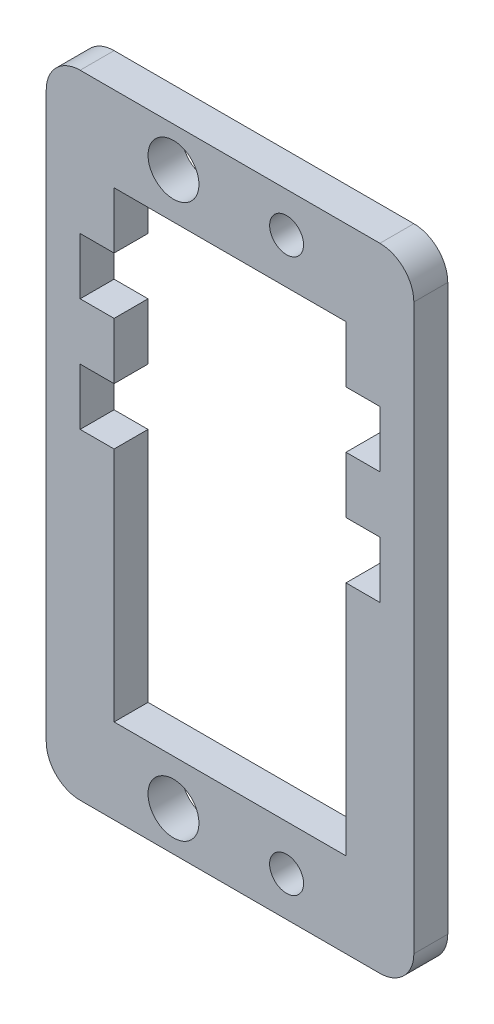
ISO-10303-21;
HEADER;
FILE_DESCRIPTION(('STEP AP214'),'2;1');
FILE_NAME('part.step','',(''),(''),'','','');
FILE_SCHEMA(('AUTOMOTIVE_DESIGN { 1 0 10303 214 1 1 1 1 }'));
ENDSEC;
DATA;
#1=APPLICATION_CONTEXT('core data for automotive mechanical design processes');
#2=APPLICATION_PROTOCOL_DEFINITION('international standard','automotive_design',2000,#1);
#3=PRODUCT_CONTEXT('',#1,'mechanical');
#4=PRODUCT('Part','Part','',(#3));
#5=PRODUCT_RELATED_PRODUCT_CATEGORY('part','',(#4));
#6=PRODUCT_DEFINITION_FORMATION('','',#4);
#7=PRODUCT_DEFINITION_CONTEXT('part definition',#1,'design');
#8=PRODUCT_DEFINITION('design','',#6,#7);
#9=PRODUCT_DEFINITION_SHAPE('','',#8);
#10=(LENGTH_UNIT() NAMED_UNIT(*) SI_UNIT(.MILLI.,.METRE.));
#11=(NAMED_UNIT(*) PLANE_ANGLE_UNIT() SI_UNIT($,.RADIAN.));
#12=(NAMED_UNIT(*) SI_UNIT($,.STERADIAN.) SOLID_ANGLE_UNIT());
#13=UNCERTAINTY_MEASURE_WITH_UNIT(LENGTH_MEASURE(1.E-05),#10,'distance_accuracy_value','');
#14=(GEOMETRIC_REPRESENTATION_CONTEXT(3) GLOBAL_UNCERTAINTY_ASSIGNED_CONTEXT((#13)) GLOBAL_UNIT_ASSIGNED_CONTEXT((#10,
#11,#12)) REPRESENTATION_CONTEXT('',''));
#15=CARTESIAN_POINT('',(0.,0.,0.));
#16=DIRECTION('',(0.,0.,1.));
#17=DIRECTION('',(1.,0.,0.));
#18=AXIS2_PLACEMENT_3D('',#15,#16,#17);
#19=CARTESIAN_POINT('',(-13.25,24.95,3.));
#20=DIRECTION('',(0.,0.,-1.));
#21=DIRECTION('',(-1.,0.,0.));
#22=AXIS2_PLACEMENT_3D('',#19,#20,#21);
#23=PLANE('',#22);
#24=CARTESIAN_POINT('',(-13.25,24.95,3.));
#25=DIRECTION('',(0.,0.,1.));
#26=DIRECTION('',(-1.,0.,0.));
#27=AXIS2_PLACEMENT_3D('',#24,#25,#26);
#28=CIRCLE('',#27,3.);
#29=CARTESIAN_POINT('',(-13.25,27.95,3.));
#30=VERTEX_POINT('',#29);
#31=CARTESIAN_POINT('',(-16.25,24.95,3.));
#32=VERTEX_POINT('',#31);
#33=EDGE_CURVE('E370',#30,#32,#28,.T.);
#34=ORIENTED_EDGE('',*,*,#33,.T.);
#35=DIRECTION('',(0.,-1.,0.));
#36=VECTOR('',#35,1.);
#37=CARTESIAN_POINT('',(-16.25,-24.95,3.));
#38=LINE('',#37,#36);
#39=CARTESIAN_POINT('',(-16.25,-24.95,3.));
#40=VERTEX_POINT('',#39);
#41=EDGE_CURVE('E373',#32,#40,#38,.T.);
#42=ORIENTED_EDGE('',*,*,#41,.T.);
#43=CARTESIAN_POINT('',(-13.25,-24.95,3.));
#44=DIRECTION('',(0.,0.,1.));
#45=DIRECTION('',(-1.,0.,0.));
#46=AXIS2_PLACEMENT_3D('',#43,#44,#45);
#47=CIRCLE('',#46,3.);
#48=CARTESIAN_POINT('',(-13.25,-27.95,3.));
#49=VERTEX_POINT('',#48);
#50=EDGE_CURVE('E376',#40,#49,#47,.T.);
#51=ORIENTED_EDGE('',*,*,#50,.T.);
#52=DIRECTION('',(1.,0.,0.));
#53=VECTOR('',#52,1.);
#54=CARTESIAN_POINT('',(13.25,-27.95,3.));
#55=LINE('',#54,#53);
#56=CARTESIAN_POINT('',(13.25,-27.95,3.));
#57=VERTEX_POINT('',#56);
#58=EDGE_CURVE('E378',#49,#57,#55,.T.);
#59=ORIENTED_EDGE('',*,*,#58,.T.);
#60=CARTESIAN_POINT('',(13.25,-24.95,3.));
#61=DIRECTION('',(0.,0.,1.));
#62=DIRECTION('',(-1.,0.,0.));
#63=AXIS2_PLACEMENT_3D('',#60,#61,#62);
#64=CIRCLE('',#63,3.);
#65=CARTESIAN_POINT('',(16.25,-24.95,3.));
#66=VERTEX_POINT('',#65);
#67=EDGE_CURVE('E380',#57,#66,#64,.T.);
#68=ORIENTED_EDGE('',*,*,#67,.T.);
#69=DIRECTION('',(0.,1.,0.));
#70=VECTOR('',#69,1.);
#71=CARTESIAN_POINT('',(16.25,24.95,3.));
#72=LINE('',#71,#70);
#73=CARTESIAN_POINT('',(16.25,24.95,3.));
#74=VERTEX_POINT('',#73);
#75=EDGE_CURVE('E382',#66,#74,#72,.T.);
#76=ORIENTED_EDGE('',*,*,#75,.T.);
#77=CARTESIAN_POINT('',(13.25,24.95,3.));
#78=DIRECTION('',(0.,0.,1.));
#79=DIRECTION('',(-1.,0.,0.));
#80=AXIS2_PLACEMENT_3D('',#77,#78,#79);
#81=CIRCLE('',#80,3.);
#82=CARTESIAN_POINT('',(13.25,27.95,3.));
#83=VERTEX_POINT('',#82);
#84=EDGE_CURVE('E384',#74,#83,#81,.T.);
#85=ORIENTED_EDGE('',*,*,#84,.T.);
#86=DIRECTION('',(-1.,0.,0.));
#87=VECTOR('',#86,1.);
#88=CARTESIAN_POINT('',(-13.25,27.95,3.));
#89=LINE('',#88,#87);
#90=EDGE_CURVE('E386',#83,#30,#89,.T.);
#91=ORIENTED_EDGE('',*,*,#90,.T.);
#92=EDGE_LOOP('',(#34,#42,#51,#59,#68,#76,#85,#91));
#93=FACE_BOUND('',#92,.T.);
#94=DIRECTION('',(0.,1.,0.));
#95=VECTOR('',#94,1.);
#96=CARTESIAN_POINT('',(10.25,0.45,3.));
#97=LINE('',#96,#95);
#98=CARTESIAN_POINT('',(10.25,-20.45,3.));
#99=VERTEX_POINT('',#98);
#100=CARTESIAN_POINT('',(10.25,0.45,3.));
#101=VERTEX_POINT('',#100);
#102=EDGE_CURVE('E218',#99,#101,#97,.T.);
#103=ORIENTED_EDGE('',*,*,#102,.F.);
#104=DIRECTION('',(1.,0.,0.));
#105=VECTOR('',#104,1.);
#106=CARTESIAN_POINT('',(-10.25,-20.45,3.));
#107=LINE('',#106,#105);
#108=CARTESIAN_POINT('',(-10.25,-20.45,3.));
#109=VERTEX_POINT('',#108);
#110=EDGE_CURVE('E277',#109,#99,#107,.T.);
#111=ORIENTED_EDGE('',*,*,#110,.F.);
#112=DIRECTION('',(0.,-1.,0.));
#113=VECTOR('',#112,1.);
#114=CARTESIAN_POINT('',(-10.25,0.449999999999998,3.));
#115=LINE('',#114,#113);
#116=CARTESIAN_POINT('',(-10.25,0.449999999999998,3.));
#117=VERTEX_POINT('',#116);
#118=EDGE_CURVE('E275',#117,#109,#115,.T.);
#119=ORIENTED_EDGE('',*,*,#118,.F.);
#120=DIRECTION('',(1.,0.,0.));
#121=VECTOR('',#120,1.);
#122=CARTESIAN_POINT('',(-13.25,0.449999999999998,3.));
#123=LINE('',#122,#121);
#124=CARTESIAN_POINT('',(-13.25,0.449999999999998,3.));
#125=VERTEX_POINT('',#124);
#126=EDGE_CURVE('E273',#125,#117,#123,.T.);
#127=ORIENTED_EDGE('',*,*,#126,.F.);
#128=DIRECTION('',(0.,-1.,0.));
#129=VECTOR('',#128,1.);
#130=CARTESIAN_POINT('',(-13.25,5.45,3.));
#131=LINE('',#130,#129);
#132=CARTESIAN_POINT('',(-13.25,5.45,3.));
#133=VERTEX_POINT('',#132);
#134=EDGE_CURVE('E271',#133,#125,#131,.T.);
#135=ORIENTED_EDGE('',*,*,#134,.F.);
#136=DIRECTION('',(-1.,0.,0.));
#137=VECTOR('',#136,1.);
#138=CARTESIAN_POINT('',(-10.25,5.45,3.));
#139=LINE('',#138,#137);
#140=CARTESIAN_POINT('',(-10.25,5.45,3.));
#141=VERTEX_POINT('',#140);
#142=EDGE_CURVE('E269',#141,#133,#139,.T.);
#143=ORIENTED_EDGE('',*,*,#142,.F.);
#144=DIRECTION('',(0.,-1.,0.));
#145=VECTOR('',#144,1.);
#146=CARTESIAN_POINT('',(-10.25,10.45,3.));
#147=LINE('',#146,#145);
#148=CARTESIAN_POINT('',(-10.25,10.45,3.));
#149=VERTEX_POINT('',#148);
#150=EDGE_CURVE('E267',#149,#141,#147,.T.);
#151=ORIENTED_EDGE('',*,*,#150,.F.);
#152=DIRECTION('',(1.,0.,0.));
#153=VECTOR('',#152,1.);
#154=CARTESIAN_POINT('',(-13.25,10.45,3.));
#155=LINE('',#154,#153);
#156=CARTESIAN_POINT('',(-13.25,10.45,3.));
#157=VERTEX_POINT('',#156);
#158=EDGE_CURVE('E265',#157,#149,#155,.T.);
#159=ORIENTED_EDGE('',*,*,#158,.F.);
#160=DIRECTION('',(0.,-1.,0.));
#161=VECTOR('',#160,1.);
#162=CARTESIAN_POINT('',(-13.25,15.45,3.));
#163=LINE('',#162,#161);
#164=CARTESIAN_POINT('',(-13.25,15.45,3.));
#165=VERTEX_POINT('',#164);
#166=EDGE_CURVE('E263',#165,#157,#163,.T.);
#167=ORIENTED_EDGE('',*,*,#166,.F.);
#168=DIRECTION('',(-1.,0.,0.));
#169=VECTOR('',#168,1.);
#170=CARTESIAN_POINT('',(-10.25,15.45,3.));
#171=LINE('',#170,#169);
#172=CARTESIAN_POINT('',(-10.25,15.45,3.));
#173=VERTEX_POINT('',#172);
#174=EDGE_CURVE('E261',#173,#165,#171,.T.);
#175=ORIENTED_EDGE('',*,*,#174,.F.);
#176=DIRECTION('',(0.,-1.,0.));
#177=VECTOR('',#176,1.);
#178=CARTESIAN_POINT('',(-10.25,20.45,3.));
#179=LINE('',#178,#177);
#180=CARTESIAN_POINT('',(-10.25,20.45,3.));
#181=VERTEX_POINT('',#180);
#182=EDGE_CURVE('E259',#181,#173,#179,.T.);
#183=ORIENTED_EDGE('',*,*,#182,.F.);
#184=DIRECTION('',(-1.,0.,0.));
#185=VECTOR('',#184,1.);
#186=CARTESIAN_POINT('',(-10.25,20.45,3.));
#187=LINE('',#186,#185);
#188=CARTESIAN_POINT('',(10.25,20.45,3.));
#189=VERTEX_POINT('',#188);
#190=EDGE_CURVE('E257',#189,#181,#187,.T.);
#191=ORIENTED_EDGE('',*,*,#190,.F.);
#192=DIRECTION('',(0.,1.,0.));
#193=VECTOR('',#192,1.);
#194=CARTESIAN_POINT('',(10.25,20.45,3.));
#195=LINE('',#194,#193);
#196=CARTESIAN_POINT('',(10.25,15.45,3.));
#197=VERTEX_POINT('',#196);
#198=EDGE_CURVE('E255',#197,#189,#195,.T.);
#199=ORIENTED_EDGE('',*,*,#198,.F.);
#200=DIRECTION('',(-1.,0.,0.));
#201=VECTOR('',#200,1.);
#202=CARTESIAN_POINT('',(10.25,15.45,3.));
#203=LINE('',#202,#201);
#204=CARTESIAN_POINT('',(13.25,15.45,3.));
#205=VERTEX_POINT('',#204);
#206=EDGE_CURVE('E253',#205,#197,#203,.T.);
#207=ORIENTED_EDGE('',*,*,#206,.F.);
#208=DIRECTION('',(0.,1.,0.));
#209=VECTOR('',#208,1.);
#210=CARTESIAN_POINT('',(13.25,15.45,3.));
#211=LINE('',#210,#209);
#212=CARTESIAN_POINT('',(13.25,10.45,3.));
#213=VERTEX_POINT('',#212);
#214=EDGE_CURVE('E251',#213,#205,#211,.T.);
#215=ORIENTED_EDGE('',*,*,#214,.F.);
#216=DIRECTION('',(1.,0.,0.));
#217=VECTOR('',#216,1.);
#218=CARTESIAN_POINT('',(13.25,10.45,3.));
#219=LINE('',#218,#217);
#220=CARTESIAN_POINT('',(10.25,10.45,3.));
#221=VERTEX_POINT('',#220);
#222=EDGE_CURVE('E249',#221,#213,#219,.T.);
#223=ORIENTED_EDGE('',*,*,#222,.F.);
#224=DIRECTION('',(0.,1.,0.));
#225=VECTOR('',#224,1.);
#226=CARTESIAN_POINT('',(10.25,10.45,3.));
#227=LINE('',#226,#225);
#228=CARTESIAN_POINT('',(10.25,5.45,3.));
#229=VERTEX_POINT('',#228);
#230=EDGE_CURVE('E247',#229,#221,#227,.T.);
#231=ORIENTED_EDGE('',*,*,#230,.F.);
#232=DIRECTION('',(-1.,0.,0.));
#233=VECTOR('',#232,1.);
#234=CARTESIAN_POINT('',(10.25,5.45,3.));
#235=LINE('',#234,#233);
#236=CARTESIAN_POINT('',(13.25,5.45,3.));
#237=VERTEX_POINT('',#236);
#238=EDGE_CURVE('E242',#237,#229,#235,.T.);
#239=ORIENTED_EDGE('',*,*,#238,.F.);
#240=DIRECTION('',(0.,1.,0.));
#241=VECTOR('',#240,1.);
#242=CARTESIAN_POINT('',(13.25,5.45,3.));
#243=LINE('',#242,#241);
#244=CARTESIAN_POINT('',(13.25,0.450000000000001,3.));
#245=VERTEX_POINT('',#244);
#246=EDGE_CURVE('E240',#245,#237,#243,.T.);
#247=ORIENTED_EDGE('',*,*,#246,.F.);
#248=DIRECTION('',(1.,0.,0.));
#249=VECTOR('',#248,1.);
#250=CARTESIAN_POINT('',(13.25,0.450000000000001,3.));
#251=LINE('',#250,#249);
#252=EDGE_CURVE('E226',#101,#245,#251,.T.);
#253=ORIENTED_EDGE('',*,*,#252,.F.);
#254=EDGE_LOOP('',(#103,#111,#119,#127,#135,#143,#151,#159,#167,#175,#183,#191,#199,#207,#215,
#223,#231,#239,#247,#253));
#255=FACE_BOUND('',#254,.T.);
#256=CARTESIAN_POINT('',(-5.,24.45,3.));
#257=DIRECTION('',(0.,0.,1.));
#258=DIRECTION('',(1.,0.,0.));
#259=AXIS2_PLACEMENT_3D('',#256,#257,#258);
#260=CIRCLE('',#259,2.25);
#261=CARTESIAN_POINT('',(-2.75,24.45,3.));
#262=VERTEX_POINT('',#261);
#263=EDGE_CURVE('E280',#262,#262,#260,.T.);
#264=ORIENTED_EDGE('',*,*,#263,.F.);
#265=EDGE_LOOP('',(#264));
#266=FACE_BOUND('',#265,.T.);
#267=CARTESIAN_POINT('',(5.,24.45,3.));
#268=DIRECTION('',(0.,0.,1.));
#269=DIRECTION('',(1.,0.,0.));
#270=AXIS2_PLACEMENT_3D('',#267,#268,#269);
#271=CIRCLE('',#270,1.5);
#272=CARTESIAN_POINT('',(6.5,24.45,3.));
#273=VERTEX_POINT('',#272);
#274=EDGE_CURVE('E596',#273,#273,#271,.T.);
#275=ORIENTED_EDGE('',*,*,#274,.F.);
#276=EDGE_LOOP('',(#275));
#277=FACE_BOUND('',#276,.T.);
#278=CARTESIAN_POINT('',(5.00000000000001,-24.45,3.));
#279=DIRECTION('',(0.,0.,1.));
#280=DIRECTION('',(-1.,0.,0.));
#281=AXIS2_PLACEMENT_3D('',#278,#279,#280);
#282=CIRCLE('',#281,1.5);
#283=CARTESIAN_POINT('',(3.50000000000001,-24.45,3.));
#284=VERTEX_POINT('',#283);
#285=EDGE_CURVE('E590',#284,#284,#282,.T.);
#286=ORIENTED_EDGE('',*,*,#285,.F.);
#287=EDGE_LOOP('',(#286));
#288=FACE_BOUND('',#287,.T.);
#289=CARTESIAN_POINT('',(-4.99999999999999,-24.45,3.));
#290=DIRECTION('',(0.,0.,1.));
#291=DIRECTION('',(-1.,0.,0.));
#292=AXIS2_PLACEMENT_3D('',#289,#290,#291);
#293=CIRCLE('',#292,2.25);
#294=CARTESIAN_POINT('',(-7.24999999999999,-24.45,3.));
#295=VERTEX_POINT('',#294);
#296=EDGE_CURVE('E581',#295,#295,#293,.T.);
#297=ORIENTED_EDGE('',*,*,#296,.F.);
#298=EDGE_LOOP('',(#297));
#299=FACE_BOUND('',#298,.T.);
#300=ADVANCED_FACE('F33',(#93,#255,#266,#277,#288,#299),#23,.F.);
#301=CARTESIAN_POINT('',(-13.25,24.95,0.));
#302=DIRECTION('',(0.,0.,-1.));
#303=DIRECTION('',(-1.,0.,0.));
#304=AXIS2_PLACEMENT_3D('',#301,#302,#303);
#305=PLANE('',#304);
#306=CARTESIAN_POINT('',(5.00000000000001,-24.45,0.));
#307=DIRECTION('',(0.,0.,1.));
#308=DIRECTION('',(-1.,0.,0.));
#309=AXIS2_PLACEMENT_3D('',#306,#307,#308);
#310=CIRCLE('',#309,1.5);
#311=CARTESIAN_POINT('',(3.50000000000001,-24.45,0.));
#312=VERTEX_POINT('',#311);
#313=EDGE_CURVE('E587',#312,#312,#310,.T.);
#314=ORIENTED_EDGE('',*,*,#313,.T.);
#315=EDGE_LOOP('',(#314));
#316=FACE_BOUND('',#315,.T.);
#317=CARTESIAN_POINT('',(-5.,24.45,0.));
#318=DIRECTION('',(0.,0.,1.));
#319=DIRECTION('',(1.,0.,0.));
#320=AXIS2_PLACEMENT_3D('',#317,#318,#319);
#321=CIRCLE('',#320,2.25);
#322=CARTESIAN_POINT('',(-2.75,24.45,0.));
#323=VERTEX_POINT('',#322);
#324=EDGE_CURVE('E599',#323,#323,#321,.T.);
#325=ORIENTED_EDGE('',*,*,#324,.T.);
#326=EDGE_LOOP('',(#325));
#327=FACE_BOUND('',#326,.T.);
#328=CARTESIAN_POINT('',(-13.25,24.95,0.));
#329=DIRECTION('',(0.,0.,1.));
#330=DIRECTION('',(-1.,0.,0.));
#331=AXIS2_PLACEMENT_3D('',#328,#329,#330);
#332=CIRCLE('',#331,3.);
#333=CARTESIAN_POINT('',(-13.25,27.95,0.));
#334=VERTEX_POINT('',#333);
#335=CARTESIAN_POINT('',(-16.25,24.95,0.));
#336=VERTEX_POINT('',#335);
#337=EDGE_CURVE('E234',#334,#336,#332,.T.);
#338=ORIENTED_EDGE('',*,*,#337,.F.);
#339=DIRECTION('',(-1.,0.,0.));
#340=VECTOR('',#339,1.);
#341=CARTESIAN_POINT('',(-13.25,27.95,0.));
#342=LINE('',#341,#340);
#343=CARTESIAN_POINT('',(13.25,27.95,0.));
#344=VERTEX_POINT('',#343);
#345=EDGE_CURVE('E374',#344,#334,#342,.T.);
#346=ORIENTED_EDGE('',*,*,#345,.F.);
#347=CARTESIAN_POINT('',(13.25,24.95,0.));
#348=DIRECTION('',(0.,0.,1.));
#349=DIRECTION('',(-1.,0.,0.));
#350=AXIS2_PLACEMENT_3D('',#347,#348,#349);
#351=CIRCLE('',#350,3.);
#352=CARTESIAN_POINT('',(16.25,24.95,0.));
#353=VERTEX_POINT('',#352);
#354=EDGE_CURVE('E401',#353,#344,#351,.T.);
#355=ORIENTED_EDGE('',*,*,#354,.F.);
#356=DIRECTION('',(0.,1.,0.));
#357=VECTOR('',#356,1.);
#358=CARTESIAN_POINT('',(16.25,24.95,0.));
#359=LINE('',#358,#357);
#360=CARTESIAN_POINT('',(16.25,-24.95,0.));
#361=VERTEX_POINT('',#360);
#362=EDGE_CURVE('E399',#361,#353,#359,.T.);
#363=ORIENTED_EDGE('',*,*,#362,.F.);
#364=CARTESIAN_POINT('',(13.25,-24.95,0.));
#365=DIRECTION('',(0.,0.,1.));
#366=DIRECTION('',(-1.,0.,0.));
#367=AXIS2_PLACEMENT_3D('',#364,#365,#366);
#368=CIRCLE('',#367,3.);
#369=CARTESIAN_POINT('',(13.25,-27.95,0.));
#370=VERTEX_POINT('',#369);
#371=EDGE_CURVE('E397',#370,#361,#368,.T.);
#372=ORIENTED_EDGE('',*,*,#371,.F.);
#373=DIRECTION('',(1.,0.,0.));
#374=VECTOR('',#373,1.);
#375=CARTESIAN_POINT('',(13.25,-27.95,0.));
#376=LINE('',#375,#374);
#377=CARTESIAN_POINT('',(-13.25,-27.95,0.));
#378=VERTEX_POINT('',#377);
#379=EDGE_CURVE('E395',#378,#370,#376,.T.);
#380=ORIENTED_EDGE('',*,*,#379,.F.);
#381=CARTESIAN_POINT('',(-13.25,-24.95,0.));
#382=DIRECTION('',(0.,0.,1.));
#383=DIRECTION('',(-1.,0.,0.));
#384=AXIS2_PLACEMENT_3D('',#381,#382,#383);
#385=CIRCLE('',#384,3.);
#386=CARTESIAN_POINT('',(-16.25,-24.95,0.));
#387=VERTEX_POINT('',#386);
#388=EDGE_CURVE('E393',#387,#378,#385,.T.);
#389=ORIENTED_EDGE('',*,*,#388,.F.);
#390=DIRECTION('',(0.,-1.,0.));
#391=VECTOR('',#390,1.);
#392=CARTESIAN_POINT('',(-16.25,-24.95,0.));
#393=LINE('',#392,#391);
#394=EDGE_CURVE('E391',#336,#387,#393,.T.);
#395=ORIENTED_EDGE('',*,*,#394,.F.);
#396=EDGE_LOOP('',(#338,#346,#355,#363,#372,#380,#389,#395));
#397=FACE_BOUND('',#396,.T.);
#398=DIRECTION('',(1.,0.,0.));
#399=VECTOR('',#398,1.);
#400=CARTESIAN_POINT('',(-10.25,-20.45,0.));
#401=LINE('',#400,#399);
#402=CARTESIAN_POINT('',(-10.25,-20.45,0.));
#403=VERTEX_POINT('',#402);
#404=CARTESIAN_POINT('',(10.25,-20.45,0.));
#405=VERTEX_POINT('',#404);
#406=EDGE_CURVE('E227',#403,#405,#401,.T.);
#407=ORIENTED_EDGE('',*,*,#406,.T.);
#408=DIRECTION('',(0.,1.,0.));
#409=VECTOR('',#408,1.);
#410=CARTESIAN_POINT('',(10.25,0.45,0.));
#411=LINE('',#410,#409);
#412=CARTESIAN_POINT('',(10.25,0.45,0.));
#413=VERTEX_POINT('',#412);
#414=EDGE_CURVE('E56',#405,#413,#411,.T.);
#415=ORIENTED_EDGE('',*,*,#414,.T.);
#416=DIRECTION('',(1.,0.,0.));
#417=VECTOR('',#416,1.);
#418=CARTESIAN_POINT('',(13.25,0.450000000000001,0.));
#419=LINE('',#418,#417);
#420=CARTESIAN_POINT('',(13.25,0.450000000000001,0.));
#421=VERTEX_POINT('',#420);
#422=EDGE_CURVE('E233',#413,#421,#419,.T.);
#423=ORIENTED_EDGE('',*,*,#422,.T.);
#424=DIRECTION('',(0.,1.,0.));
#425=VECTOR('',#424,1.);
#426=CARTESIAN_POINT('',(13.25,5.45,0.));
#427=LINE('',#426,#425);
#428=CARTESIAN_POINT('',(13.25,5.45,0.));
#429=VERTEX_POINT('',#428);
#430=EDGE_CURVE('E282',#421,#429,#427,.T.);
#431=ORIENTED_EDGE('',*,*,#430,.T.);
#432=DIRECTION('',(-1.,0.,0.));
#433=VECTOR('',#432,1.);
#434=CARTESIAN_POINT('',(10.25,5.45,0.));
#435=LINE('',#434,#433);
#436=CARTESIAN_POINT('',(10.25,5.45,0.));
#437=VERTEX_POINT('',#436);
#438=EDGE_CURVE('E285',#429,#437,#435,.T.);
#439=ORIENTED_EDGE('',*,*,#438,.T.);
#440=DIRECTION('',(0.,1.,0.));
#441=VECTOR('',#440,1.);
#442=CARTESIAN_POINT('',(10.25,10.45,0.));
#443=LINE('',#442,#441);
#444=CARTESIAN_POINT('',(10.25,10.45,0.));
#445=VERTEX_POINT('',#444);
#446=EDGE_CURVE('E288',#437,#445,#443,.T.);
#447=ORIENTED_EDGE('',*,*,#446,.T.);
#448=DIRECTION('',(1.,0.,0.));
#449=VECTOR('',#448,1.);
#450=CARTESIAN_POINT('',(13.25,10.45,0.));
#451=LINE('',#450,#449);
#452=CARTESIAN_POINT('',(13.25,10.45,0.));
#453=VERTEX_POINT('',#452);
#454=EDGE_CURVE('E291',#445,#453,#451,.T.);
#455=ORIENTED_EDGE('',*,*,#454,.T.);
#456=DIRECTION('',(0.,1.,0.));
#457=VECTOR('',#456,1.);
#458=CARTESIAN_POINT('',(13.25,15.45,0.));
#459=LINE('',#458,#457);
#460=CARTESIAN_POINT('',(13.25,15.45,0.));
#461=VERTEX_POINT('',#460);
#462=EDGE_CURVE('E294',#453,#461,#459,.T.);
#463=ORIENTED_EDGE('',*,*,#462,.T.);
#464=DIRECTION('',(-1.,0.,0.));
#465=VECTOR('',#464,1.);
#466=CARTESIAN_POINT('',(10.25,15.45,0.));
#467=LINE('',#466,#465);
#468=CARTESIAN_POINT('',(10.25,15.45,0.));
#469=VERTEX_POINT('',#468);
#470=EDGE_CURVE('E297',#461,#469,#467,.T.);
#471=ORIENTED_EDGE('',*,*,#470,.T.);
#472=DIRECTION('',(0.,1.,0.));
#473=VECTOR('',#472,1.);
#474=CARTESIAN_POINT('',(10.25,20.45,0.));
#475=LINE('',#474,#473);
#476=CARTESIAN_POINT('',(10.25,20.45,0.));
#477=VERTEX_POINT('',#476);
#478=EDGE_CURVE('E300',#469,#477,#475,.T.);
#479=ORIENTED_EDGE('',*,*,#478,.T.);
#480=DIRECTION('',(-1.,0.,0.));
#481=VECTOR('',#480,1.);
#482=CARTESIAN_POINT('',(-10.25,20.45,0.));
#483=LINE('',#482,#481);
#484=CARTESIAN_POINT('',(-10.25,20.45,0.));
#485=VERTEX_POINT('',#484);
#486=EDGE_CURVE('E303',#477,#485,#483,.T.);
#487=ORIENTED_EDGE('',*,*,#486,.T.);
#488=DIRECTION('',(0.,-1.,0.));
#489=VECTOR('',#488,1.);
#490=CARTESIAN_POINT('',(-10.25,20.45,0.));
#491=LINE('',#490,#489);
#492=CARTESIAN_POINT('',(-10.25,15.45,0.));
#493=VERTEX_POINT('',#492);
#494=EDGE_CURVE('E306',#485,#493,#491,.T.);
#495=ORIENTED_EDGE('',*,*,#494,.T.);
#496=DIRECTION('',(-1.,0.,0.));
#497=VECTOR('',#496,1.);
#498=CARTESIAN_POINT('',(-10.25,15.45,0.));
#499=LINE('',#498,#497);
#500=CARTESIAN_POINT('',(-13.25,15.45,0.));
#501=VERTEX_POINT('',#500);
#502=EDGE_CURVE('E309',#493,#501,#499,.T.);
#503=ORIENTED_EDGE('',*,*,#502,.T.);
#504=DIRECTION('',(0.,-1.,0.));
#505=VECTOR('',#504,1.);
#506=CARTESIAN_POINT('',(-13.25,15.45,0.));
#507=LINE('',#506,#505);
#508=CARTESIAN_POINT('',(-13.25,10.45,0.));
#509=VERTEX_POINT('',#508);
#510=EDGE_CURVE('E312',#501,#509,#507,.T.);
#511=ORIENTED_EDGE('',*,*,#510,.T.);
#512=DIRECTION('',(1.,0.,0.));
#513=VECTOR('',#512,1.);
#514=CARTESIAN_POINT('',(-13.25,10.45,0.));
#515=LINE('',#514,#513);
#516=CARTESIAN_POINT('',(-10.25,10.45,0.));
#517=VERTEX_POINT('',#516);
#518=EDGE_CURVE('E315',#509,#517,#515,.T.);
#519=ORIENTED_EDGE('',*,*,#518,.T.);
#520=DIRECTION('',(0.,-1.,0.));
#521=VECTOR('',#520,1.);
#522=CARTESIAN_POINT('',(-10.25,10.45,0.));
#523=LINE('',#522,#521);
#524=CARTESIAN_POINT('',(-10.25,5.45,0.));
#525=VERTEX_POINT('',#524);
#526=EDGE_CURVE('E318',#517,#525,#523,.T.);
#527=ORIENTED_EDGE('',*,*,#526,.T.);
#528=DIRECTION('',(-1.,0.,0.));
#529=VECTOR('',#528,1.);
#530=CARTESIAN_POINT('',(-10.25,5.45,0.));
#531=LINE('',#530,#529);
#532=CARTESIAN_POINT('',(-13.25,5.45,0.));
#533=VERTEX_POINT('',#532);
#534=EDGE_CURVE('E321',#525,#533,#531,.T.);
#535=ORIENTED_EDGE('',*,*,#534,.T.);
#536=DIRECTION('',(0.,-1.,0.));
#537=VECTOR('',#536,1.);
#538=CARTESIAN_POINT('',(-13.25,5.45,0.));
#539=LINE('',#538,#537);
#540=CARTESIAN_POINT('',(-13.25,0.449999999999998,0.));
#541=VERTEX_POINT('',#540);
#542=EDGE_CURVE('E324',#533,#541,#539,.T.);
#543=ORIENTED_EDGE('',*,*,#542,.T.);
#544=DIRECTION('',(1.,0.,0.));
#545=VECTOR('',#544,1.);
#546=CARTESIAN_POINT('',(-13.25,0.449999999999998,0.));
#547=LINE('',#546,#545);
#548=CARTESIAN_POINT('',(-10.25,0.449999999999998,0.));
#549=VERTEX_POINT('',#548);
#550=EDGE_CURVE('E327',#541,#549,#547,.T.);
#551=ORIENTED_EDGE('',*,*,#550,.T.);
#552=DIRECTION('',(0.,-1.,0.));
#553=VECTOR('',#552,1.);
#554=CARTESIAN_POINT('',(-10.25,0.449999999999998,0.));
#555=LINE('',#554,#553);
#556=EDGE_CURVE('E330',#549,#403,#555,.T.);
#557=ORIENTED_EDGE('',*,*,#556,.T.);
#558=EDGE_LOOP('',(#407,#415,#423,#431,#439,#447,#455,#463,#471,#479,#487,#495,#503,#511,#519,
#527,#535,#543,#551,#557));
#559=FACE_BOUND('',#558,.T.);
#560=CARTESIAN_POINT('',(5.,24.45,0.));
#561=DIRECTION('',(0.,0.,1.));
#562=DIRECTION('',(1.,0.,0.));
#563=AXIS2_PLACEMENT_3D('',#560,#561,#562);
#564=CIRCLE('',#563,1.5);
#565=CARTESIAN_POINT('',(6.5,24.45,0.));
#566=VERTEX_POINT('',#565);
#567=EDGE_CURVE('E593',#566,#566,#564,.T.);
#568=ORIENTED_EDGE('',*,*,#567,.T.);
#569=EDGE_LOOP('',(#568));
#570=FACE_BOUND('',#569,.T.);
#571=CARTESIAN_POINT('',(-4.99999999999999,-24.45,0.));
#572=DIRECTION('',(0.,0.,1.));
#573=DIRECTION('',(-1.,0.,0.));
#574=AXIS2_PLACEMENT_3D('',#571,#572,#573);
#575=CIRCLE('',#574,2.25);
#576=CARTESIAN_POINT('',(-7.24999999999999,-24.45,0.));
#577=VERTEX_POINT('',#576);
#578=EDGE_CURVE('E584',#577,#577,#575,.T.);
#579=ORIENTED_EDGE('',*,*,#578,.T.);
#580=EDGE_LOOP('',(#579));
#581=FACE_BOUND('',#580,.T.);
#582=ADVANCED_FACE('F431',(#316,#327,#397,#559,#570,#581),#305,.T.);
#583=CARTESIAN_POINT('',(-13.25,24.95,3.));
#584=DIRECTION('',(0.,0.,-1.));
#585=DIRECTION('',(-1.,0.,0.));
#586=AXIS2_PLACEMENT_3D('',#583,#584,#585);
#587=CYLINDRICAL_SURFACE('',#586,3.);
#588=ORIENTED_EDGE('',*,*,#337,.T.);
#589=DIRECTION('',(0.,0.,-1.));
#590=VECTOR('',#589,1.);
#591=CARTESIAN_POINT('',(-16.25,24.95,3.));
#592=LINE('',#591,#590);
#593=EDGE_CURVE('E11',#32,#336,#592,.T.);
#594=ORIENTED_EDGE('',*,*,#593,.F.);
#595=ORIENTED_EDGE('',*,*,#33,.F.);
#596=DIRECTION('',(0.,0.,-1.));
#597=VECTOR('',#596,1.);
#598=CARTESIAN_POINT('',(-13.25,27.95,3.));
#599=LINE('',#598,#597);
#600=EDGE_CURVE('E388',#30,#334,#599,.T.);
#601=ORIENTED_EDGE('',*,*,#600,.T.);
#602=EDGE_LOOP('',(#588,#594,#595,#601));
#603=FACE_BOUND('',#602,.T.);
#604=ADVANCED_FACE('F35',(#603),#587,.T.);
#605=CARTESIAN_POINT('',(-16.25,-24.95,3.));
#606=DIRECTION('',(1.,0.,0.));
#607=DIRECTION('',(0.,1.,0.));
#608=AXIS2_PLACEMENT_3D('',#605,#606,#607);
#609=PLANE('',#608);
#610=ORIENTED_EDGE('',*,*,#394,.T.);
#611=DIRECTION('',(0.,0.,-1.));
#612=VECTOR('',#611,1.);
#613=CARTESIAN_POINT('',(-16.25,-24.95,3.));
#614=LINE('',#613,#612);
#615=EDGE_CURVE('E41',#40,#387,#614,.T.);
#616=ORIENTED_EDGE('',*,*,#615,.F.);
#617=ORIENTED_EDGE('',*,*,#41,.F.);
#618=ORIENTED_EDGE('',*,*,#593,.T.);
#619=EDGE_LOOP('',(#610,#616,#617,#618));
#620=FACE_BOUND('',#619,.T.);
#621=ADVANCED_FACE('F448',(#620),#609,.F.);
#622=CARTESIAN_POINT('',(-13.25,-24.95,3.));
#623=DIRECTION('',(0.,0.,-1.));
#624=DIRECTION('',(-1.,0.,0.));
#625=AXIS2_PLACEMENT_3D('',#622,#623,#624);
#626=CYLINDRICAL_SURFACE('',#625,3.);
#627=ORIENTED_EDGE('',*,*,#388,.T.);
#628=DIRECTION('',(0.,0.,-1.));
#629=VECTOR('',#628,1.);
#630=CARTESIAN_POINT('',(-13.25,-27.95,3.));
#631=LINE('',#630,#629);
#632=EDGE_CURVE('E418',#49,#378,#631,.T.);
#633=ORIENTED_EDGE('',*,*,#632,.F.);
#634=ORIENTED_EDGE('',*,*,#50,.F.);
#635=ORIENTED_EDGE('',*,*,#615,.T.);
#636=EDGE_LOOP('',(#627,#633,#634,#635));
#637=FACE_BOUND('',#636,.T.);
#638=ADVANCED_FACE('F425',(#637),#626,.T.);
#639=CARTESIAN_POINT('',(13.25,-27.95,3.));
#640=DIRECTION('',(0.,1.,0.));
#641=DIRECTION('',(-1.,0.,0.));
#642=AXIS2_PLACEMENT_3D('',#639,#640,#641);
#643=PLANE('',#642);
#644=ORIENTED_EDGE('',*,*,#379,.T.);
#645=DIRECTION('',(0.,0.,-1.));
#646=VECTOR('',#645,1.);
#647=CARTESIAN_POINT('',(13.25,-27.95,3.));
#648=LINE('',#647,#646);
#649=EDGE_CURVE('E415',#57,#370,#648,.T.);
#650=ORIENTED_EDGE('',*,*,#649,.F.);
#651=ORIENTED_EDGE('',*,*,#58,.F.);
#652=ORIENTED_EDGE('',*,*,#632,.T.);
#653=EDGE_LOOP('',(#644,#650,#651,#652));
#654=FACE_BOUND('',#653,.T.);
#655=ADVANCED_FACE('F437',(#654),#643,.F.);
#656=CARTESIAN_POINT('',(13.25,-24.95,3.));
#657=DIRECTION('',(0.,0.,-1.));
#658=DIRECTION('',(-1.,0.,0.));
#659=AXIS2_PLACEMENT_3D('',#656,#657,#658);
#660=CYLINDRICAL_SURFACE('',#659,3.);
#661=ORIENTED_EDGE('',*,*,#371,.T.);
#662=DIRECTION('',(0.,0.,-1.));
#663=VECTOR('',#662,1.);
#664=CARTESIAN_POINT('',(16.25,-24.95,3.));
#665=LINE('',#664,#663);
#666=EDGE_CURVE('E412',#66,#361,#665,.T.);
#667=ORIENTED_EDGE('',*,*,#666,.F.);
#668=ORIENTED_EDGE('',*,*,#67,.F.);
#669=ORIENTED_EDGE('',*,*,#649,.T.);
#670=EDGE_LOOP('',(#661,#667,#668,#669));
#671=FACE_BOUND('',#670,.T.);
#672=ADVANCED_FACE('F441',(#671),#660,.T.);
#673=CARTESIAN_POINT('',(16.25,24.95,3.));
#674=DIRECTION('',(-1.,0.,0.));
#675=DIRECTION('',(0.,-1.,0.));
#676=AXIS2_PLACEMENT_3D('',#673,#674,#675);
#677=PLANE('',#676);
#678=ORIENTED_EDGE('',*,*,#362,.T.);
#679=DIRECTION('',(0.,0.,-1.));
#680=VECTOR('',#679,1.);
#681=CARTESIAN_POINT('',(16.25,24.95,3.));
#682=LINE('',#681,#680);
#683=EDGE_CURVE('E409',#74,#353,#682,.T.);
#684=ORIENTED_EDGE('',*,*,#683,.F.);
#685=ORIENTED_EDGE('',*,*,#75,.F.);
#686=ORIENTED_EDGE('',*,*,#666,.T.);
#687=EDGE_LOOP('',(#678,#684,#685,#686));
#688=FACE_BOUND('',#687,.T.);
#689=ADVANCED_FACE('F461',(#688),#677,.F.);
#690=CARTESIAN_POINT('',(13.25,24.95,3.));
#691=DIRECTION('',(0.,0.,-1.));
#692=DIRECTION('',(-1.,0.,0.));
#693=AXIS2_PLACEMENT_3D('',#690,#691,#692);
#694=CYLINDRICAL_SURFACE('',#693,3.);
#695=ORIENTED_EDGE('',*,*,#354,.T.);
#696=DIRECTION('',(0.,0.,-1.));
#697=VECTOR('',#696,1.);
#698=CARTESIAN_POINT('',(13.25,27.95,3.));
#699=LINE('',#698,#697);
#700=EDGE_CURVE('E406',#83,#344,#699,.T.);
#701=ORIENTED_EDGE('',*,*,#700,.F.);
#702=ORIENTED_EDGE('',*,*,#84,.F.);
#703=ORIENTED_EDGE('',*,*,#683,.T.);
#704=EDGE_LOOP('',(#695,#701,#702,#703));
#705=FACE_BOUND('',#704,.T.);
#706=ADVANCED_FACE('F459',(#705),#694,.T.);
#707=CARTESIAN_POINT('',(-13.25,27.95,3.));
#708=DIRECTION('',(0.,-1.,0.));
#709=DIRECTION('',(1.,0.,0.));
#710=AXIS2_PLACEMENT_3D('',#707,#708,#709);
#711=PLANE('',#710);
#712=ORIENTED_EDGE('',*,*,#345,.T.);
#713=ORIENTED_EDGE('',*,*,#600,.F.);
#714=ORIENTED_EDGE('',*,*,#90,.F.);
#715=ORIENTED_EDGE('',*,*,#700,.T.);
#716=EDGE_LOOP('',(#712,#713,#714,#715));
#717=FACE_BOUND('',#716,.T.);
#718=ADVANCED_FACE('F454',(#717),#711,.F.);
#719=CARTESIAN_POINT('',(10.25,0.45,3.));
#720=DIRECTION('',(-1.,0.,0.));
#721=DIRECTION('',(0.,-1.,0.));
#722=AXIS2_PLACEMENT_3D('',#719,#720,#721);
#723=PLANE('',#722);
#724=ORIENTED_EDGE('',*,*,#414,.F.);
#725=DIRECTION('',(0.,0.,-1.));
#726=VECTOR('',#725,1.);
#727=CARTESIAN_POINT('',(10.25,-20.45,3.));
#728=LINE('',#727,#726);
#729=EDGE_CURVE('E222',#99,#405,#728,.T.);
#730=ORIENTED_EDGE('',*,*,#729,.F.);
#731=ORIENTED_EDGE('',*,*,#102,.T.);
#732=DIRECTION('',(0.,0.,-1.));
#733=VECTOR('',#732,1.);
#734=CARTESIAN_POINT('',(10.25,0.45,3.));
#735=LINE('',#734,#733);
#736=EDGE_CURVE('E221',#101,#413,#735,.T.);
#737=ORIENTED_EDGE('',*,*,#736,.T.);
#738=EDGE_LOOP('',(#724,#730,#731,#737));
#739=FACE_BOUND('',#738,.T.);
#740=ADVANCED_FACE('F220',(#739),#723,.T.);
#741=CARTESIAN_POINT('',(13.25,0.450000000000001,3.));
#742=DIRECTION('',(0.,1.,0.));
#743=DIRECTION('',(-1.,0.,0.));
#744=AXIS2_PLACEMENT_3D('',#741,#742,#743);
#745=PLANE('',#744);
#746=ORIENTED_EDGE('',*,*,#422,.F.);
#747=ORIENTED_EDGE('',*,*,#736,.F.);
#748=ORIENTED_EDGE('',*,*,#252,.T.);
#749=DIRECTION('',(0.,0.,-1.));
#750=VECTOR('',#749,1.);
#751=CARTESIAN_POINT('',(13.25,0.450000000000001,3.));
#752=LINE('',#751,#750);
#753=EDGE_CURVE('E235',#245,#421,#752,.T.);
#754=ORIENTED_EDGE('',*,*,#753,.T.);
#755=EDGE_LOOP('',(#746,#747,#748,#754));
#756=FACE_BOUND('',#755,.T.);
#757=ADVANCED_FACE('F230',(#756),#745,.T.);
#758=CARTESIAN_POINT('',(13.25,5.45,3.));
#759=DIRECTION('',(-1.,0.,0.));
#760=DIRECTION('',(0.,0.,1.));
#761=AXIS2_PLACEMENT_3D('',#758,#759,#760);
#762=PLANE('',#761);
#763=ORIENTED_EDGE('',*,*,#430,.F.);
#764=ORIENTED_EDGE('',*,*,#753,.F.);
#765=ORIENTED_EDGE('',*,*,#246,.T.);
#766=DIRECTION('',(0.,0.,-1.));
#767=VECTOR('',#766,1.);
#768=CARTESIAN_POINT('',(13.25,5.45,3.));
#769=LINE('',#768,#767);
#770=EDGE_CURVE('E367',#237,#429,#769,.T.);
#771=ORIENTED_EDGE('',*,*,#770,.T.);
#772=EDGE_LOOP('',(#763,#764,#765,#771));
#773=FACE_BOUND('',#772,.T.);
#774=ADVANCED_FACE('F487',(#773),#762,.T.);
#775=CARTESIAN_POINT('',(10.25,5.45,3.));
#776=DIRECTION('',(0.,-1.,0.));
#777=DIRECTION('',(0.,0.,-1.));
#778=AXIS2_PLACEMENT_3D('',#775,#776,#777);
#779=PLANE('',#778);
#780=ORIENTED_EDGE('',*,*,#438,.F.);
#781=ORIENTED_EDGE('',*,*,#770,.F.);
#782=ORIENTED_EDGE('',*,*,#238,.T.);
#783=DIRECTION('',(0.,0.,-1.));
#784=VECTOR('',#783,1.);
#785=CARTESIAN_POINT('',(10.25,5.45,3.));
#786=LINE('',#785,#784);
#787=EDGE_CURVE('E365',#229,#437,#786,.T.);
#788=ORIENTED_EDGE('',*,*,#787,.T.);
#789=EDGE_LOOP('',(#780,#781,#782,#788));
#790=FACE_BOUND('',#789,.T.);
#791=ADVANCED_FACE('F491',(#790),#779,.T.);
#792=CARTESIAN_POINT('',(10.25,10.45,3.));
#793=DIRECTION('',(-1.,0.,0.));
#794=DIRECTION('',(0.,0.,1.));
#795=AXIS2_PLACEMENT_3D('',#792,#793,#794);
#796=PLANE('',#795);
#797=ORIENTED_EDGE('',*,*,#446,.F.);
#798=ORIENTED_EDGE('',*,*,#787,.F.);
#799=ORIENTED_EDGE('',*,*,#230,.T.);
#800=DIRECTION('',(0.,0.,-1.));
#801=VECTOR('',#800,1.);
#802=CARTESIAN_POINT('',(10.25,10.45,3.));
#803=LINE('',#802,#801);
#804=EDGE_CURVE('E363',#221,#445,#803,.T.);
#805=ORIENTED_EDGE('',*,*,#804,.T.);
#806=EDGE_LOOP('',(#797,#798,#799,#805));
#807=FACE_BOUND('',#806,.T.);
#808=ADVANCED_FACE('F497',(#807),#796,.T.);
#809=CARTESIAN_POINT('',(13.25,10.45,3.));
#810=DIRECTION('',(0.,1.,0.));
#811=DIRECTION('',(0.,0.,1.));
#812=AXIS2_PLACEMENT_3D('',#809,#810,#811);
#813=PLANE('',#812);
#814=ORIENTED_EDGE('',*,*,#454,.F.);
#815=ORIENTED_EDGE('',*,*,#804,.F.);
#816=ORIENTED_EDGE('',*,*,#222,.T.);
#817=DIRECTION('',(0.,0.,-1.));
#818=VECTOR('',#817,1.);
#819=CARTESIAN_POINT('',(13.25,10.45,3.));
#820=LINE('',#819,#818);
#821=EDGE_CURVE('E361',#213,#453,#820,.T.);
#822=ORIENTED_EDGE('',*,*,#821,.T.);
#823=EDGE_LOOP('',(#814,#815,#816,#822));
#824=FACE_BOUND('',#823,.T.);
#825=ADVANCED_FACE('F501',(#824),#813,.T.);
#826=CARTESIAN_POINT('',(13.25,15.45,3.));
#827=DIRECTION('',(-1.,0.,0.));
#828=DIRECTION('',(0.,0.,1.));
#829=AXIS2_PLACEMENT_3D('',#826,#827,#828);
#830=PLANE('',#829);
#831=ORIENTED_EDGE('',*,*,#462,.F.);
#832=ORIENTED_EDGE('',*,*,#821,.F.);
#833=ORIENTED_EDGE('',*,*,#214,.T.);
#834=DIRECTION('',(0.,0.,-1.));
#835=VECTOR('',#834,1.);
#836=CARTESIAN_POINT('',(13.25,15.45,3.));
#837=LINE('',#836,#835);
#838=EDGE_CURVE('E359',#205,#461,#837,.T.);
#839=ORIENTED_EDGE('',*,*,#838,.T.);
#840=EDGE_LOOP('',(#831,#832,#833,#839));
#841=FACE_BOUND('',#840,.T.);
#842=ADVANCED_FACE('F505',(#841),#830,.T.);
#843=CARTESIAN_POINT('',(10.25,15.45,3.));
#844=DIRECTION('',(0.,-1.,0.));
#845=DIRECTION('',(1.,0.,0.));
#846=AXIS2_PLACEMENT_3D('',#843,#844,#845);
#847=PLANE('',#846);
#848=ORIENTED_EDGE('',*,*,#470,.F.);
#849=ORIENTED_EDGE('',*,*,#838,.F.);
#850=ORIENTED_EDGE('',*,*,#206,.T.);
#851=DIRECTION('',(0.,0.,-1.));
#852=VECTOR('',#851,1.);
#853=CARTESIAN_POINT('',(10.25,15.45,3.));
#854=LINE('',#853,#852);
#855=EDGE_CURVE('E357',#197,#469,#854,.T.);
#856=ORIENTED_EDGE('',*,*,#855,.T.);
#857=EDGE_LOOP('',(#848,#849,#850,#856));
#858=FACE_BOUND('',#857,.T.);
#859=ADVANCED_FACE('F509',(#858),#847,.T.);
#860=CARTESIAN_POINT('',(10.25,20.45,3.));
#861=DIRECTION('',(-1.,0.,0.));
#862=DIRECTION('',(0.,-1.,0.));
#863=AXIS2_PLACEMENT_3D('',#860,#861,#862);
#864=PLANE('',#863);
#865=ORIENTED_EDGE('',*,*,#478,.F.);
#866=ORIENTED_EDGE('',*,*,#855,.F.);
#867=ORIENTED_EDGE('',*,*,#198,.T.);
#868=DIRECTION('',(0.,0.,-1.));
#869=VECTOR('',#868,1.);
#870=CARTESIAN_POINT('',(10.25,20.45,3.));
#871=LINE('',#870,#869);
#872=EDGE_CURVE('E355',#189,#477,#871,.T.);
#873=ORIENTED_EDGE('',*,*,#872,.T.);
#874=EDGE_LOOP('',(#865,#866,#867,#873));
#875=FACE_BOUND('',#874,.T.);
#876=ADVANCED_FACE('F513',(#875),#864,.T.);
#877=CARTESIAN_POINT('',(-10.25,20.45,3.));
#878=DIRECTION('',(0.,-1.,0.));
#879=DIRECTION('',(0.,0.,-1.));
#880=AXIS2_PLACEMENT_3D('',#877,#878,#879);
#881=PLANE('',#880);
#882=ORIENTED_EDGE('',*,*,#486,.F.);
#883=ORIENTED_EDGE('',*,*,#872,.F.);
#884=ORIENTED_EDGE('',*,*,#190,.T.);
#885=DIRECTION('',(0.,0.,-1.));
#886=VECTOR('',#885,1.);
#887=CARTESIAN_POINT('',(-10.25,20.45,3.));
#888=LINE('',#887,#886);
#889=EDGE_CURVE('E353',#181,#485,#888,.T.);
#890=ORIENTED_EDGE('',*,*,#889,.T.);
#891=EDGE_LOOP('',(#882,#883,#884,#890));
#892=FACE_BOUND('',#891,.T.);
#893=ADVANCED_FACE('F517',(#892),#881,.T.);
#894=CARTESIAN_POINT('',(-10.25,20.45,3.));
#895=DIRECTION('',(1.,0.,0.));
#896=DIRECTION('',(0.,1.,0.));
#897=AXIS2_PLACEMENT_3D('',#894,#895,#896);
#898=PLANE('',#897);
#899=ORIENTED_EDGE('',*,*,#494,.F.);
#900=ORIENTED_EDGE('',*,*,#889,.F.);
#901=ORIENTED_EDGE('',*,*,#182,.T.);
#902=DIRECTION('',(0.,0.,-1.));
#903=VECTOR('',#902,1.);
#904=CARTESIAN_POINT('',(-10.25,15.45,3.));
#905=LINE('',#904,#903);
#906=EDGE_CURVE('E351',#173,#493,#905,.T.);
#907=ORIENTED_EDGE('',*,*,#906,.T.);
#908=EDGE_LOOP('',(#899,#900,#901,#907));
#909=FACE_BOUND('',#908,.T.);
#910=ADVANCED_FACE('F521',(#909),#898,.T.);
#911=CARTESIAN_POINT('',(-10.25,15.45,3.));
#912=DIRECTION('',(0.,-1.,0.));
#913=DIRECTION('',(1.,0.,0.));
#914=AXIS2_PLACEMENT_3D('',#911,#912,#913);
#915=PLANE('',#914);
#916=ORIENTED_EDGE('',*,*,#502,.F.);
#917=ORIENTED_EDGE('',*,*,#906,.F.);
#918=ORIENTED_EDGE('',*,*,#174,.T.);
#919=DIRECTION('',(0.,0.,-1.));
#920=VECTOR('',#919,1.);
#921=CARTESIAN_POINT('',(-13.25,15.45,3.));
#922=LINE('',#921,#920);
#923=EDGE_CURVE('E349',#165,#501,#922,.T.);
#924=ORIENTED_EDGE('',*,*,#923,.T.);
#925=EDGE_LOOP('',(#916,#917,#918,#924));
#926=FACE_BOUND('',#925,.T.);
#927=ADVANCED_FACE('F525',(#926),#915,.T.);
#928=CARTESIAN_POINT('',(-13.25,15.45,3.));
#929=DIRECTION('',(1.,0.,0.));
#930=DIRECTION('',(0.,1.,0.));
#931=AXIS2_PLACEMENT_3D('',#928,#929,#930);
#932=PLANE('',#931);
#933=ORIENTED_EDGE('',*,*,#510,.F.);
#934=ORIENTED_EDGE('',*,*,#923,.F.);
#935=ORIENTED_EDGE('',*,*,#166,.T.);
#936=DIRECTION('',(0.,0.,-1.));
#937=VECTOR('',#936,1.);
#938=CARTESIAN_POINT('',(-13.25,10.45,3.));
#939=LINE('',#938,#937);
#940=EDGE_CURVE('E347',#157,#509,#939,.T.);
#941=ORIENTED_EDGE('',*,*,#940,.T.);
#942=EDGE_LOOP('',(#933,#934,#935,#941));
#943=FACE_BOUND('',#942,.T.);
#944=ADVANCED_FACE('F529',(#943),#932,.T.);
#945=CARTESIAN_POINT('',(-13.25,10.45,3.));
#946=DIRECTION('',(0.,1.,0.));
#947=DIRECTION('',(0.,0.,1.));
#948=AXIS2_PLACEMENT_3D('',#945,#946,#947);
#949=PLANE('',#948);
#950=ORIENTED_EDGE('',*,*,#518,.F.);
#951=ORIENTED_EDGE('',*,*,#940,.F.);
#952=ORIENTED_EDGE('',*,*,#158,.T.);
#953=DIRECTION('',(0.,0.,-1.));
#954=VECTOR('',#953,1.);
#955=CARTESIAN_POINT('',(-10.25,10.45,3.));
#956=LINE('',#955,#954);
#957=EDGE_CURVE('E345',#149,#517,#956,.T.);
#958=ORIENTED_EDGE('',*,*,#957,.T.);
#959=EDGE_LOOP('',(#950,#951,#952,#958));
#960=FACE_BOUND('',#959,.T.);
#961=ADVANCED_FACE('F533',(#960),#949,.T.);
#962=CARTESIAN_POINT('',(-10.25,10.45,3.));
#963=DIRECTION('',(1.,0.,0.));
#964=DIRECTION('',(0.,0.,-1.));
#965=AXIS2_PLACEMENT_3D('',#962,#963,#964);
#966=PLANE('',#965);
#967=ORIENTED_EDGE('',*,*,#526,.F.);
#968=ORIENTED_EDGE('',*,*,#957,.F.);
#969=ORIENTED_EDGE('',*,*,#150,.T.);
#970=DIRECTION('',(0.,0.,-1.));
#971=VECTOR('',#970,1.);
#972=CARTESIAN_POINT('',(-10.25,5.45,3.));
#973=LINE('',#972,#971);
#974=EDGE_CURVE('E343',#141,#525,#973,.T.);
#975=ORIENTED_EDGE('',*,*,#974,.T.);
#976=EDGE_LOOP('',(#967,#968,#969,#975));
#977=FACE_BOUND('',#976,.T.);
#978=ADVANCED_FACE('F537',(#977),#966,.T.);
#979=CARTESIAN_POINT('',(-10.25,5.45,3.));
#980=DIRECTION('',(0.,-1.,0.));
#981=DIRECTION('',(1.,0.,0.));
#982=AXIS2_PLACEMENT_3D('',#979,#980,#981);
#983=PLANE('',#982);
#984=ORIENTED_EDGE('',*,*,#534,.F.);
#985=ORIENTED_EDGE('',*,*,#974,.F.);
#986=ORIENTED_EDGE('',*,*,#142,.T.);
#987=DIRECTION('',(0.,0.,-1.));
#988=VECTOR('',#987,1.);
#989=CARTESIAN_POINT('',(-13.25,5.45,3.));
#990=LINE('',#989,#988);
#991=EDGE_CURVE('E341',#133,#533,#990,.T.);
#992=ORIENTED_EDGE('',*,*,#991,.T.);
#993=EDGE_LOOP('',(#984,#985,#986,#992));
#994=FACE_BOUND('',#993,.T.);
#995=ADVANCED_FACE('F541',(#994),#983,.T.);
#996=CARTESIAN_POINT('',(-13.25,5.45,3.));
#997=DIRECTION('',(1.,0.,0.));
#998=DIRECTION('',(0.,0.,-1.));
#999=AXIS2_PLACEMENT_3D('',#996,#997,#998);
#1000=PLANE('',#999);
#1001=ORIENTED_EDGE('',*,*,#542,.F.);
#1002=ORIENTED_EDGE('',*,*,#991,.F.);
#1003=ORIENTED_EDGE('',*,*,#134,.T.);
#1004=DIRECTION('',(0.,0.,-1.));
#1005=VECTOR('',#1004,1.);
#1006=CARTESIAN_POINT('',(-13.25,0.449999999999998,3.));
#1007=LINE('',#1006,#1005);
#1008=EDGE_CURVE('E339',#125,#541,#1007,.T.);
#1009=ORIENTED_EDGE('',*,*,#1008,.T.);
#1010=EDGE_LOOP('',(#1001,#1002,#1003,#1009));
#1011=FACE_BOUND('',#1010,.T.);
#1012=ADVANCED_FACE('F545',(#1011),#1000,.T.);
#1013=CARTESIAN_POINT('',(-13.25,0.449999999999998,3.));
#1014=DIRECTION('',(0.,1.,0.));
#1015=DIRECTION('',(0.,0.,1.));
#1016=AXIS2_PLACEMENT_3D('',#1013,#1014,#1015);
#1017=PLANE('',#1016);
#1018=ORIENTED_EDGE('',*,*,#550,.F.);
#1019=ORIENTED_EDGE('',*,*,#1008,.F.);
#1020=ORIENTED_EDGE('',*,*,#126,.T.);
#1021=DIRECTION('',(0.,0.,-1.));
#1022=VECTOR('',#1021,1.);
#1023=CARTESIAN_POINT('',(-10.25,0.449999999999998,3.));
#1024=LINE('',#1023,#1022);
#1025=EDGE_CURVE('E337',#117,#549,#1024,.T.);
#1026=ORIENTED_EDGE('',*,*,#1025,.T.);
#1027=EDGE_LOOP('',(#1018,#1019,#1020,#1026));
#1028=FACE_BOUND('',#1027,.T.);
#1029=ADVANCED_FACE('F549',(#1028),#1017,.T.);
#1030=CARTESIAN_POINT('',(-10.25,0.449999999999998,3.));
#1031=DIRECTION('',(1.,0.,0.));
#1032=DIRECTION('',(0.,1.,0.));
#1033=AXIS2_PLACEMENT_3D('',#1030,#1031,#1032);
#1034=PLANE('',#1033);
#1035=ORIENTED_EDGE('',*,*,#556,.F.);
#1036=ORIENTED_EDGE('',*,*,#1025,.F.);
#1037=ORIENTED_EDGE('',*,*,#118,.T.);
#1038=DIRECTION('',(0.,0.,-1.));
#1039=VECTOR('',#1038,1.);
#1040=CARTESIAN_POINT('',(-10.25,-20.45,3.));
#1041=LINE('',#1040,#1039);
#1042=EDGE_CURVE('E48',#109,#403,#1041,.T.);
#1043=ORIENTED_EDGE('',*,*,#1042,.T.);
#1044=EDGE_LOOP('',(#1035,#1036,#1037,#1043));
#1045=FACE_BOUND('',#1044,.T.);
#1046=ADVANCED_FACE('F553',(#1045),#1034,.T.);
#1047=CARTESIAN_POINT('',(-10.25,-20.45,3.));
#1048=DIRECTION('',(0.,1.,0.));
#1049=DIRECTION('',(0.,0.,1.));
#1050=AXIS2_PLACEMENT_3D('',#1047,#1048,#1049);
#1051=PLANE('',#1050);
#1052=ORIENTED_EDGE('',*,*,#406,.F.);
#1053=ORIENTED_EDGE('',*,*,#1042,.F.);
#1054=ORIENTED_EDGE('',*,*,#110,.T.);
#1055=ORIENTED_EDGE('',*,*,#729,.T.);
#1056=EDGE_LOOP('',(#1052,#1053,#1054,#1055));
#1057=FACE_BOUND('',#1056,.T.);
#1058=ADVANCED_FACE('F557',(#1057),#1051,.T.);
#1059=CARTESIAN_POINT('',(-5.,24.45,3.));
#1060=DIRECTION('',(0.,0.,-1.));
#1061=DIRECTION('',(-1.,0.,0.));
#1062=AXIS2_PLACEMENT_3D('',#1059,#1060,#1061);
#1063=CYLINDRICAL_SURFACE('',#1062,2.25);
#1064=ORIENTED_EDGE('',*,*,#263,.T.);
#1065=EDGE_LOOP('',(#1064));
#1066=FACE_BOUND('',#1065,.T.);
#1067=ORIENTED_EDGE('',*,*,#324,.F.);
#1068=EDGE_LOOP('',(#1067));
#1069=FACE_BOUND('',#1068,.T.);
#1070=ADVANCED_FACE('F561',(#1066,#1069),#1063,.F.);
#1071=CARTESIAN_POINT('',(5.,24.45,3.));
#1072=DIRECTION('',(0.,0.,-1.));
#1073=DIRECTION('',(-1.,0.,0.));
#1074=AXIS2_PLACEMENT_3D('',#1071,#1072,#1073);
#1075=CYLINDRICAL_SURFACE('',#1074,1.5);
#1076=ORIENTED_EDGE('',*,*,#274,.T.);
#1077=EDGE_LOOP('',(#1076));
#1078=FACE_BOUND('',#1077,.T.);
#1079=ORIENTED_EDGE('',*,*,#567,.F.);
#1080=EDGE_LOOP('',(#1079));
#1081=FACE_BOUND('',#1080,.T.);
#1082=ADVANCED_FACE('F564',(#1078,#1081),#1075,.F.);
#1083=CARTESIAN_POINT('',(5.00000000000001,-24.45,3.));
#1084=DIRECTION('',(0.,0.,-1.));
#1085=DIRECTION('',(-1.,0.,0.));
#1086=AXIS2_PLACEMENT_3D('',#1083,#1084,#1085);
#1087=CYLINDRICAL_SURFACE('',#1086,1.5);
#1088=ORIENTED_EDGE('',*,*,#285,.T.);
#1089=EDGE_LOOP('',(#1088));
#1090=FACE_BOUND('',#1089,.T.);
#1091=ORIENTED_EDGE('',*,*,#313,.F.);
#1092=EDGE_LOOP('',(#1091));
#1093=FACE_BOUND('',#1092,.T.);
#1094=ADVANCED_FACE('F568',(#1090,#1093),#1087,.F.);
#1095=CARTESIAN_POINT('',(-4.99999999999999,-24.45,3.));
#1096=DIRECTION('',(0.,0.,-1.));
#1097=DIRECTION('',(-1.,0.,0.));
#1098=AXIS2_PLACEMENT_3D('',#1095,#1096,#1097);
#1099=CYLINDRICAL_SURFACE('',#1098,2.25);
#1100=ORIENTED_EDGE('',*,*,#296,.T.);
#1101=EDGE_LOOP('',(#1100));
#1102=FACE_BOUND('',#1101,.T.);
#1103=ORIENTED_EDGE('',*,*,#578,.F.);
#1104=EDGE_LOOP('',(#1103));
#1105=FACE_BOUND('',#1104,.T.);
#1106=ADVANCED_FACE('F572',(#1102,#1105),#1099,.F.);
#1107=CLOSED_SHELL('',(#300,#582,#604,#621,#638,#655,#672,#689,#706,#718,#740,#757,#774,#791,
#808,#825,#842,#859,#876,#893,#910,#927,#944,#961,#978,#995,#1012,#1029,#1046,#1058,#1070,#1082,
#1094,#1106));
#1108=MANIFOLD_SOLID_BREP('B2',#1107);
#1109=ADVANCED_BREP_SHAPE_REPRESENTATION('',(#18,#1108),#14);
#1110=SHAPE_DEFINITION_REPRESENTATION(#9,#1109);
ENDSEC;
END-ISO-10303-21;
